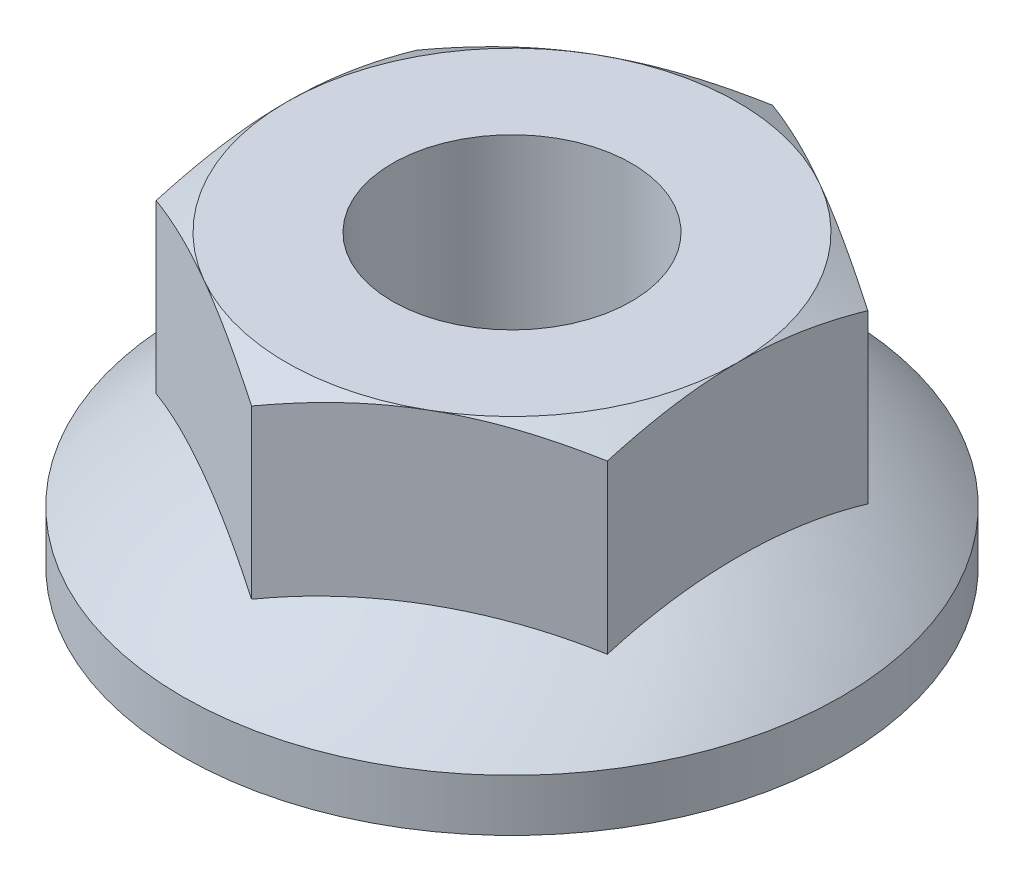
ISO-10303-21;
HEADER;
FILE_DESCRIPTION(('STEP AP214'),'2;1');
FILE_NAME('part.step','',(''),(''),'','','');
FILE_SCHEMA(('AUTOMOTIVE_DESIGN { 1 0 10303 214 1 1 1 1 }'));
ENDSEC;
DATA;
#1=APPLICATION_CONTEXT('core data for automotive mechanical design processes');
#2=APPLICATION_PROTOCOL_DEFINITION('international standard','automotive_design',2000,#1);
#3=PRODUCT_CONTEXT('',#1,'mechanical');
#4=PRODUCT('Part','Part','',(#3));
#5=PRODUCT_RELATED_PRODUCT_CATEGORY('part','',(#4));
#6=PRODUCT_DEFINITION_FORMATION('','',#4);
#7=PRODUCT_DEFINITION_CONTEXT('part definition',#1,'design');
#8=PRODUCT_DEFINITION('design','',#6,#7);
#9=PRODUCT_DEFINITION_SHAPE('','',#8);
#10=(LENGTH_UNIT() NAMED_UNIT(*) SI_UNIT(.MILLI.,.METRE.));
#11=(NAMED_UNIT(*) PLANE_ANGLE_UNIT() SI_UNIT($,.RADIAN.));
#12=(NAMED_UNIT(*) SI_UNIT($,.STERADIAN.) SOLID_ANGLE_UNIT());
#13=UNCERTAINTY_MEASURE_WITH_UNIT(LENGTH_MEASURE(1.E-05),#10,'distance_accuracy_value','');
#14=(GEOMETRIC_REPRESENTATION_CONTEXT(3) GLOBAL_UNCERTAINTY_ASSIGNED_CONTEXT((#13)) GLOBAL_UNIT_ASSIGNED_CONTEXT((#10,
#11,#12)) REPRESENTATION_CONTEXT('',''));
#15=CARTESIAN_POINT('',(0.,0.,0.));
#16=DIRECTION('',(0.,0.,1.));
#17=DIRECTION('',(1.,0.,0.));
#18=AXIS2_PLACEMENT_3D('',#15,#16,#17);
#19=CARTESIAN_POINT('',(0.,-5.78571428571428,0.));
#20=DIRECTION('',(0.,1.,0.));
#21=DIRECTION('',(1.,0.,0.));
#22=AXIS2_PLACEMENT_3D('',#19,#20,#21);
#23=SPHERICAL_SURFACE('',#22,8.78571428571428);
#24=CARTESIAN_POINT('',(1.95,-5.78571428571428,3.37749907475931));
#25=DIRECTION('',(0.5,0.,0.866025403784439));
#26=DIRECTION('',(0.866025403784439,0.,-0.5));
#27=AXIS2_PLACEMENT_3D('',#24,#25,#26);
#28=CIRCLE('',#27,7.87266000219774);
#29=CARTESIAN_POINT('',(0.,1.75807624095094,4.50333209967908));
#30=VERTEX_POINT('',#29);
#31=CARTESIAN_POINT('',(3.9,1.75807624095094,2.25166604983954));
#32=VERTEX_POINT('',#31);
#33=EDGE_CURVE('E231',#30,#32,#28,.F.);
#34=ORIENTED_EDGE('',*,*,#33,.F.);
#35=CARTESIAN_POINT('',(-1.95,-5.78571428571428,3.37749907475931));
#36=DIRECTION('',(-0.5,0.,0.866025403784439));
#37=DIRECTION('',(0.866025403784439,0.,0.5));
#38=AXIS2_PLACEMENT_3D('',#35,#36,#37);
#39=CIRCLE('',#38,7.87266000219774);
#40=CARTESIAN_POINT('',(-3.9,1.75807624095094,2.25166604983954));
#41=VERTEX_POINT('',#40);
#42=EDGE_CURVE('E254',#41,#30,#39,.F.);
#43=ORIENTED_EDGE('',*,*,#42,.F.);
#44=CARTESIAN_POINT('',(-3.9,-5.78571428571428,0.));
#45=DIRECTION('',(-1.,0.,0.));
#46=DIRECTION('',(0.,0.,1.));
#47=AXIS2_PLACEMENT_3D('',#44,#45,#46);
#48=CIRCLE('',#47,7.87266000219774);
#49=CARTESIAN_POINT('',(-3.9,1.75807624095094,-2.25166604983954));
#50=VERTEX_POINT('',#49);
#51=EDGE_CURVE('E251',#50,#41,#48,.F.);
#52=ORIENTED_EDGE('',*,*,#51,.F.);
#53=CARTESIAN_POINT('',(-1.95,-5.78571428571428,-3.37749907475931));
#54=DIRECTION('',(-0.5,0.,-0.866025403784438));
#55=DIRECTION('',(-0.866025403784438,0.,0.5));
#56=AXIS2_PLACEMENT_3D('',#53,#54,#55);
#57=CIRCLE('',#56,7.87266000219774);
#58=CARTESIAN_POINT('',(0.,1.75807624095094,-4.50333209967908));
#59=VERTEX_POINT('',#58);
#60=EDGE_CURVE('E248',#59,#50,#57,.F.);
#61=ORIENTED_EDGE('',*,*,#60,.F.);
#62=CARTESIAN_POINT('',(1.95,-5.78571428571428,-3.37749907475931));
#63=DIRECTION('',(0.5,0.,-0.866025403784439));
#64=DIRECTION('',(-0.866025403784439,0.,-0.5));
#65=AXIS2_PLACEMENT_3D('',#62,#63,#64);
#66=CIRCLE('',#65,7.87266000219774);
#67=CARTESIAN_POINT('',(3.9,1.75807624095094,-2.25166604983954));
#68=VERTEX_POINT('',#67);
#69=EDGE_CURVE('E245',#68,#59,#66,.F.);
#70=ORIENTED_EDGE('',*,*,#69,.F.);
#71=CARTESIAN_POINT('',(3.9,-5.78571428571428,0.));
#72=DIRECTION('',(1.,0.,0.));
#73=DIRECTION('',(0.,0.,-1.));
#74=AXIS2_PLACEMENT_3D('',#71,#72,#73);
#75=CIRCLE('',#74,7.87266000219774);
#76=EDGE_CURVE('E242',#32,#68,#75,.F.);
#77=ORIENTED_EDGE('',*,*,#76,.F.);
#78=EDGE_LOOP('',(#34,#43,#52,#61,#70,#77));
#79=FACE_BOUND('',#78,.T.);
#80=CARTESIAN_POINT('',(0.,0.899999999999998,0.));
#81=DIRECTION('',(0.,1.,0.));
#82=DIRECTION('',(0.,0.,1.));
#83=AXIS2_PLACEMENT_3D('',#80,#81,#82);
#84=CIRCLE('',#83,5.7);
#85=CARTESIAN_POINT('',(0.,0.899999999999998,5.7));
#86=VERTEX_POINT('',#85);
#87=EDGE_CURVE('E235',#86,#86,#84,.T.);
#88=ORIENTED_EDGE('',*,*,#87,.T.);
#89=EDGE_LOOP('',(#88));
#90=FACE_BOUND('',#89,.T.);
#91=ADVANCED_FACE('F36',(#79,#90),#23,.T.);
#92=CARTESIAN_POINT('',(0.,55.,0.));
#93=DIRECTION('',(0.,1.,0.));
#94=DIRECTION('',(0.,0.,1.));
#95=AXIS2_PLACEMENT_3D('',#92,#93,#94);
#96=CYLINDRICAL_SURFACE('',#95,5.7);
#97=CARTESIAN_POINT('',(0.,0.,0.));
#98=DIRECTION('',(0.,1.,0.));
#99=DIRECTION('',(0.,0.,1.));
#100=AXIS2_PLACEMENT_3D('',#97,#98,#99);
#101=CIRCLE('',#100,5.7);
#102=CARTESIAN_POINT('',(0.,0.,5.7));
#103=VERTEX_POINT('',#102);
#104=EDGE_CURVE('E237',#103,#103,#101,.T.);
#105=ORIENTED_EDGE('',*,*,#104,.T.);
#106=EDGE_LOOP('',(#105));
#107=FACE_BOUND('',#106,.T.);
#108=ORIENTED_EDGE('',*,*,#87,.F.);
#109=EDGE_LOOP('',(#108));
#110=FACE_BOUND('',#109,.T.);
#111=ADVANCED_FACE('F220',(#107,#110),#96,.T.);
#112=CARTESIAN_POINT('',(0.,0.,0.));
#113=DIRECTION('',(0.,-1.,0.));
#114=DIRECTION('',(0.,0.,-1.));
#115=AXIS2_PLACEMENT_3D('',#112,#113,#114);
#116=PLANE('',#115);
#117=CARTESIAN_POINT('',(0.,0.,0.));
#118=DIRECTION('',(0.,1.,0.));
#119=DIRECTION('',(0.,0.,1.));
#120=AXIS2_PLACEMENT_3D('',#117,#118,#119);
#121=CIRCLE('',#120,2.067);
#122=CARTESIAN_POINT('',(0.,0.,2.067));
#123=VERTEX_POINT('',#122);
#124=EDGE_CURVE('E126',#123,#123,#121,.T.);
#125=ORIENTED_EDGE('',*,*,#124,.T.);
#126=EDGE_LOOP('',(#125));
#127=FACE_BOUND('',#126,.T.);
#128=ORIENTED_EDGE('',*,*,#104,.F.);
#129=EDGE_LOOP('',(#128));
#130=FACE_BOUND('',#129,.T.);
#131=ADVANCED_FACE('F225',(#127,#130),#116,.T.);
#132=CARTESIAN_POINT('',(3.9,5.,2.25166604983954));
#133=DIRECTION('',(0.5,0.,0.866025403784439));
#134=DIRECTION('',(0.866025403784439,0.,-0.5));
#135=AXIS2_PLACEMENT_3D('',#132,#133,#134);
#136=PLANE('',#135);
#137=CARTESIAN_POINT('',(-0.000200000000000082,4.65159938060884,4.50344756973292));
#138=CARTESIAN_POINT('',(0.171184755948663,4.7087485432908,4.40449853475096));
#139=CARTESIAN_POINT('',(0.344048895227203,4.76072355207449,4.30469537740526));
#140=CARTESIAN_POINT('',(0.692770475854431,4.85144628830391,4.1033608789579));
#141=CARTESIAN_POINT('',(0.868634113331803,4.89016192166708,4.00182596051967));
#142=CARTESIAN_POINT('',(1.21818189703585,4.95042822234695,3.8000144535035));
#143=CARTESIAN_POINT('',(1.39181226217759,4.97237999753731,3.69976891544943));
#144=CARTESIAN_POINT('',(1.73988995117111,4.9985854749427,3.49880616801012));
#145=CARTESIAN_POINT('',(1.91433600991871,5.00286087795652,3.39808968903312));
#146=CARTESIAN_POINT('',(2.24029611773847,4.99396488127702,3.2098965330383));
#147=CARTESIAN_POINT('',(2.39185897047853,4.98297774999823,3.12239167920968));
#148=CARTESIAN_POINT('',(2.69399724856389,4.94815551398196,2.94795206302461));
#149=CARTESIAN_POINT('',(2.84457162893063,4.92430851477371,2.86101790398681));
#150=CARTESIAN_POINT('',(3.14733282069943,4.86469306648916,2.68621864841892));
#151=CARTESIAN_POINT('',(3.29948131430489,4.8286719181888,2.59837567467901));
#152=CARTESIAN_POINT('',(3.60150908691111,4.74691815520425,2.42399985886207));
#153=CARTESIAN_POINT('',(3.75139223511225,4.70120474892166,2.33746478290115));
#154=CARTESIAN_POINT('',(3.9002,4.65159938060884,2.2515505797857));
#155=B_SPLINE_CURVE_WITH_KNOTS('',3,(#137,#138,#139,#140,#141,#142,#143,#144,#145,#146,#147,
#148,#149,#150,#151,#152,#153,#154),.UNSPECIFIED.,.F.,.F.,(4,2,2,2,2,2,2,2,4),(0.,
0.618197035132391,1.23788000142301,1.8422261918665,2.44583022230471,2.97139286484403,
3.49744245160843,4.03516045034723,4.57182258173635),.UNSPECIFIED.);
#156=CARTESIAN_POINT('',(0.,4.65166604983954,4.50333209967908));
#157=VERTEX_POINT('',#156);
#158=CARTESIAN_POINT('',(1.95,5.,3.37749907475931));
#159=VERTEX_POINT('',#158);
#160=EDGE_CURVE('E104',#157,#159,#155,.T.);
#161=ORIENTED_EDGE('',*,*,#160,.F.);
#162=DIRECTION('',(0.,-1.,0.));
#163=VECTOR('',#162,1.);
#164=CARTESIAN_POINT('',(0.,5.,4.50333209967908));
#165=LINE('',#164,#163);
#166=EDGE_CURVE('E114',#157,#30,#165,.T.);
#167=ORIENTED_EDGE('',*,*,#166,.T.);
#168=ORIENTED_EDGE('',*,*,#33,.T.);
#169=DIRECTION('',(0.,-1.,0.));
#170=VECTOR('',#169,1.);
#171=CARTESIAN_POINT('',(3.9,5.,2.25166604983954));
#172=LINE('',#171,#170);
#173=CARTESIAN_POINT('',(3.9,4.65166604983954,2.25166604983954));
#174=VERTEX_POINT('',#173);
#175=EDGE_CURVE('E134',#174,#32,#172,.T.);
#176=ORIENTED_EDGE('',*,*,#175,.F.);
#177=EDGE_CURVE('E115',#159,#174,#155,.T.);
#178=ORIENTED_EDGE('',*,*,#177,.F.);
#179=EDGE_LOOP('',(#161,#167,#168,#176,#178));
#180=FACE_BOUND('',#179,.T.);
#181=ADVANCED_FACE('F132',(#180),#136,.T.);
#182=CARTESIAN_POINT('',(3.9,5.,-2.25166604983954));
#183=DIRECTION('',(1.,0.,0.));
#184=DIRECTION('',(0.,0.,-1.));
#185=AXIS2_PLACEMENT_3D('',#182,#183,#184);
#186=PLANE('',#185);
#187=CARTESIAN_POINT('',(3.9,3.07917792629661,-6.08432177184287));
#188=CARTESIAN_POINT('',(3.9,3.1620981895609,-5.91368140178134));
#189=CARTESIAN_POINT('',(3.9,3.24423377045389,-5.7426531777552));
#190=CARTESIAN_POINT('',(3.9,3.40649497934568,-5.39961491114535));
#191=CARTESIAN_POINT('',(3.9,3.48662029758723,-5.22760472220462));
#192=CARTESIAN_POINT('',(3.9,3.64481583556669,-4.8815273093431));
#193=CARTESIAN_POINT('',(3.9,3.72287280136912,-4.70745400621611));
#194=CARTESIAN_POINT('',(3.9,3.87584038658809,-4.35793550270963));
#195=CARTESIAN_POINT('',(3.9,3.950751152236,-4.18249036654178));
#196=CARTESIAN_POINT('',(3.9,4.09900019028108,-3.82414006320308));
#197=CARTESIAN_POINT('',(3.9,4.17220536925185,-3.64117953708319));
#198=CARTESIAN_POINT('',(3.9,4.31316212940151,-3.27313126153532));
#199=CARTESIAN_POINT('',(3.9,4.38091310354078,-3.08804327793909));
#200=CARTESIAN_POINT('',(3.9,4.50920922127308,-2.71578063532756));
#201=CARTESIAN_POINT('',(3.9,4.56976864749844,-2.52861094798131));
#202=CARTESIAN_POINT('',(3.9,4.68176218466094,-2.15158666244942));
#203=CARTESIAN_POINT('',(3.9,4.73319913202587,-1.96173291870356));
#204=CARTESIAN_POINT('',(3.9,4.82422595411218,-1.58029898099176));
#205=CARTESIAN_POINT('',(3.9,4.86388168140834,-1.38873479456714));
#206=CARTESIAN_POINT('',(3.9,4.92913241508771,-1.00318642113787));
#207=CARTESIAN_POINT('',(3.9,4.95472880998371,-0.809202475046858));
#208=CARTESIAN_POINT('',(3.9,4.98948534774504,-0.422331919835105));
#209=CARTESIAN_POINT('',(3.9,4.99885956393458,-0.229465029674007));
#210=CARTESIAN_POINT('',(3.9,5.00094273264838,0.156375622946879));
#211=CARTESIAN_POINT('',(3.9,4.99365146262056,0.349349386799463));
#212=CARTESIAN_POINT('',(3.9,4.96773130495737,0.675902537095185));
#213=CARTESIAN_POINT('',(3.9,4.95318922276409,0.809826843464921));
#214=CARTESIAN_POINT('',(3.9,4.91696428480891,1.0767127390436));
#215=CARTESIAN_POINT('',(3.9,4.89528048799788,1.20967419901933));
#216=CARTESIAN_POINT('',(3.9,4.82065430217073,1.60692794758031));
#217=CARTESIAN_POINT('',(3.9,4.75815013897267,1.86944499791454));
#218=CARTESIAN_POINT('',(3.9,4.64954364169666,2.26201758457893));
#219=CARTESIAN_POINT('',(3.9,4.61035647054217,2.39410235633202));
#220=CARTESIAN_POINT('',(3.9,4.52785595123815,2.65698935483899));
#221=CARTESIAN_POINT('',(3.9,4.48454257542994,2.78779157298919));
#222=CARTESIAN_POINT('',(3.9,4.39448935088307,3.04815370956295));
#223=CARTESIAN_POINT('',(3.9,4.34775059286303,3.17771400870979));
#224=CARTESIAN_POINT('',(3.9,4.25140203199345,3.4357575315207));
#225=CARTESIAN_POINT('',(3.9,4.20179226558378,3.56424076883152));
#226=CARTESIAN_POINT('',(3.9,4.07990434010133,3.8713248113076));
#227=CARTESIAN_POINT('',(3.9,4.0064789070627,4.04946944510241));
#228=CARTESIAN_POINT('',(3.9,3.85595449207032,4.40420470587554));
#229=CARTESIAN_POINT('',(3.9,3.77885526712492,4.58079522914429));
#230=CARTESIAN_POINT('',(3.9,3.62173416571981,4.93271412207387));
#231=CARTESIAN_POINT('',(3.9,3.5417116524511,5.10804220664676));
#232=CARTESIAN_POINT('',(3.9,3.37933503891529,5.45761707415352));
#233=CARTESIAN_POINT('',(3.9,3.29698088567242,5.63186383240939));
#234=CARTESIAN_POINT('',(3.9,3.04692511116692,6.15365090231731));
#235=CARTESIAN_POINT('',(3.9,2.87640966500424,6.4998417990242));
#236=CARTESIAN_POINT('',(3.9,2.53036940246811,7.18963705346156));
#237=CARTESIAN_POINT('',(3.9,2.35484523973633,7.53324174136513));
#238=CARTESIAN_POINT('',(3.9,2.01551141266023,8.18909122007097));
#239=CARTESIAN_POINT('',(3.9,1.8519949261735,8.50148798480561));
#240=CARTESIAN_POINT('',(3.9,1.52273598453401,9.12511955233899));
#241=CARTESIAN_POINT('',(3.9,1.35699344446375,9.43635431022844));
#242=CARTESIAN_POINT('',(3.9,1.02425312936935,10.0571028576461));
#243=CARTESIAN_POINT('',(3.9,0.857259774122418,10.3666190193858));
#244=CARTESIAN_POINT('',(3.9,0.521949337141364,10.9849104967807));
#245=CARTESIAN_POINT('',(3.9,0.353632333020366,11.2936858545082));
#246=CARTESIAN_POINT('',(3.9,0.184823057742641,11.602189863334));
#247=B_SPLINE_CURVE_WITH_KNOTS('',3,(#187,#188,#189,#190,#191,#192,#193,#194,#195,#196,#197,
#198,#199,#200,#201,#202,#203,#204,#205,#206,#207,#208,#209,#210,#211,#212,#213,#214,#215,#216,
#217,#218,#219,#220,#221,#222,#223,#224,#225,#226,#227,#228,#229,#230,#231,#232,#233,#234,#235,
#236,#237,#238,#239,#240,#241,#242,#243,#244,#245,#246),.UNSPECIFIED.,.F.,.F.,(4,2,2,2,2,2,2,2,
2,2,2,2,2,2,2,2,2,2,2,2,2,2,2,2,2,2,2,2,2,4),(0.,0.569168580260882,1.13842433050601,
1.71071890667252,2.28298685381383,2.87410654280125,3.46529193126533,4.05528284332578,
4.64508998825942,5.23153547093413,5.81792302528702,6.39651166541883,6.97510803210922,
7.37904725542088,7.78303972628634,8.5914582612306,9.00474817923754,9.4180408677964,
9.83120252173289,10.2443589328241,10.8223523046405,11.4003839592605,11.9785422920706,
12.5567137714204,13.7143613219592,14.8718584832686,15.9296577137364,16.987497411453,
18.0425688880894,19.0975789543823),.UNSPECIFIED.);
#248=CARTESIAN_POINT('',(3.9,5.,0.));
#249=VERTEX_POINT('',#248);
#250=EDGE_CURVE('E122',#174,#249,#247,.F.);
#251=ORIENTED_EDGE('',*,*,#250,.F.);
#252=ORIENTED_EDGE('',*,*,#175,.T.);
#253=ORIENTED_EDGE('',*,*,#76,.T.);
#254=DIRECTION('',(0.,-1.,0.));
#255=VECTOR('',#254,1.);
#256=CARTESIAN_POINT('',(3.9,5.,-2.25166604983954));
#257=LINE('',#256,#255);
#258=CARTESIAN_POINT('',(3.9,4.65166604983954,-2.25166604983954));
#259=VERTEX_POINT('',#258);
#260=EDGE_CURVE('E262',#259,#68,#257,.T.);
#261=ORIENTED_EDGE('',*,*,#260,.F.);
#262=EDGE_CURVE('E135',#249,#259,#247,.F.);
#263=ORIENTED_EDGE('',*,*,#262,.F.);
#264=EDGE_LOOP('',(#251,#252,#253,#261,#263));
#265=FACE_BOUND('',#264,.T.);
#266=ADVANCED_FACE('F198',(#265),#186,.T.);
#267=CARTESIAN_POINT('',(0.,5.,-4.50333209967908));
#268=DIRECTION('',(0.5,0.,-0.866025403784439));
#269=DIRECTION('',(-0.866025403784439,0.,-0.5));
#270=AXIS2_PLACEMENT_3D('',#267,#268,#269);
#271=PLANE('',#270);
#272=CARTESIAN_POINT('',(3.9002,4.65159938060884,-2.2515505797857));
#273=CARTESIAN_POINT('',(3.72881524405134,4.7087485432908,-2.35049961476766));
#274=CARTESIAN_POINT('',(3.5559511047728,4.76072355207449,-2.45030277211336));
#275=CARTESIAN_POINT('',(3.20722952414557,4.85144628830391,-2.65163727056072));
#276=CARTESIAN_POINT('',(3.03136588666819,4.89016192166708,-2.75317218899895));
#277=CARTESIAN_POINT('',(2.68181810296414,4.95042822234695,-2.95498369601512));
#278=CARTESIAN_POINT('',(2.50818773782241,4.97237999753731,-3.0552292340692));
#279=CARTESIAN_POINT('',(2.16011004882889,4.9985854749427,-3.25619198150851));
#280=CARTESIAN_POINT('',(1.98566399008129,5.00286087795652,-3.3569084604855));
#281=CARTESIAN_POINT('',(1.65970388226153,4.99396488127702,-3.54510161648032));
#282=CARTESIAN_POINT('',(1.50814102952147,4.98297774999823,-3.63260647030894));
#283=CARTESIAN_POINT('',(1.20600275143611,4.94815551398196,-3.80704608649401));
#284=CARTESIAN_POINT('',(1.05542837106937,4.92430851477371,-3.89398024553181));
#285=CARTESIAN_POINT('',(0.752667179300567,4.86469306648916,-4.0687795010997));
#286=CARTESIAN_POINT('',(0.600518685695105,4.8286719181888,-4.15662247483961));
#287=CARTESIAN_POINT('',(0.298490913088887,4.74691815520425,-4.33099829065655));
#288=CARTESIAN_POINT('',(0.14860776488775,4.70120474892166,-4.41753336661747));
#289=CARTESIAN_POINT('',(-0.000200000000000154,4.65159938060884,-4.50344756973292));
#290=B_SPLINE_CURVE_WITH_KNOTS('',3,(#272,#273,#274,#275,#276,#277,#278,#279,#280,#281,#282,
#283,#284,#285,#286,#287,#288,#289),.UNSPECIFIED.,.F.,.F.,(4,2,2,2,2,2,2,2,4),(0.,
0.618197035132391,1.237880001423,1.8422261918665,2.44583022230471,2.97139286484403,
3.49744245160843,4.03516045034723,4.57182258173635),.UNSPECIFIED.);
#291=CARTESIAN_POINT('',(1.95,5.,-3.37749907475931));
#292=VERTEX_POINT('',#291);
#293=EDGE_CURVE('E192',#259,#292,#290,.T.);
#294=ORIENTED_EDGE('',*,*,#293,.F.);
#295=ORIENTED_EDGE('',*,*,#260,.T.);
#296=ORIENTED_EDGE('',*,*,#69,.T.);
#297=DIRECTION('',(0.,-1.,0.));
#298=VECTOR('',#297,1.);
#299=CARTESIAN_POINT('',(0.,5.,-4.50333209967908));
#300=LINE('',#299,#298);
#301=CARTESIAN_POINT('',(0.,4.65166604983954,-4.50333209967908));
#302=VERTEX_POINT('',#301);
#303=EDGE_CURVE('E261',#302,#59,#300,.T.);
#304=ORIENTED_EDGE('',*,*,#303,.F.);
#305=EDGE_CURVE('E186',#292,#302,#290,.T.);
#306=ORIENTED_EDGE('',*,*,#305,.F.);
#307=EDGE_LOOP('',(#294,#295,#296,#304,#306));
#308=FACE_BOUND('',#307,.T.);
#309=ADVANCED_FACE('F194',(#308),#271,.T.);
#310=CARTESIAN_POINT('',(-3.9,5.,-2.25166604983954));
#311=DIRECTION('',(-0.5,0.,-0.866025403784438));
#312=DIRECTION('',(-0.866025403784438,0.,0.5));
#313=AXIS2_PLACEMENT_3D('',#310,#311,#312);
#314=PLANE('',#313);
#315=CARTESIAN_POINT('',(0.000199999999999611,4.65159938060884,-4.50344756973292));
#316=CARTESIAN_POINT('',(-0.171184755948662,4.7087485432908,-4.40449853475096));
#317=CARTESIAN_POINT('',(-0.344048895227202,4.76072355207449,-4.30469537740526));
#318=CARTESIAN_POINT('',(-0.692770475854432,4.85144628830391,-4.1033608789579));
#319=CARTESIAN_POINT('',(-0.868634113331803,4.89016192166708,-4.00182596051967));
#320=CARTESIAN_POINT('',(-1.21818189703585,4.95042822234695,-3.8000144535035));
#321=CARTESIAN_POINT('',(-1.39181226217759,4.97237999753731,-3.69976891544943));
#322=CARTESIAN_POINT('',(-1.73988995117111,4.9985854749427,-3.49880616801011));
#323=CARTESIAN_POINT('',(-1.91433600991871,5.00286087795652,-3.39808968903312));
#324=CARTESIAN_POINT('',(-2.24029611773847,4.99396488127702,-3.2098965330383));
#325=CARTESIAN_POINT('',(-2.39185897047853,4.98297774999823,-3.12239167920968));
#326=CARTESIAN_POINT('',(-2.69399724856389,4.94815551398196,-2.94795206302461));
#327=CARTESIAN_POINT('',(-2.84457162893063,4.92430851477371,-2.86101790398681));
#328=CARTESIAN_POINT('',(-3.14733282069943,4.86469306648916,-2.68621864841892));
#329=CARTESIAN_POINT('',(-3.29948131430489,4.8286719181888,-2.59837567467901));
#330=CARTESIAN_POINT('',(-3.60150908691111,4.74691815520425,-2.42399985886207));
#331=CARTESIAN_POINT('',(-3.75139223511225,4.70120474892166,-2.33746478290115));
#332=CARTESIAN_POINT('',(-3.9002,4.65159938060884,-2.2515505797857));
#333=B_SPLINE_CURVE_WITH_KNOTS('',3,(#315,#316,#317,#318,#319,#320,#321,#322,#323,#324,#325,
#326,#327,#328,#329,#330,#331,#332),.UNSPECIFIED.,.F.,.F.,(4,2,2,2,2,2,2,2,4),(0.,
0.618197035132391,1.23788000142301,1.8422261918665,2.44583022230471,2.97139286484403,
3.49744245160843,4.03516045034724,4.57182258173636),.UNSPECIFIED.);
#334=CARTESIAN_POINT('',(-1.95,5.,-3.37749907475931));
#335=VERTEX_POINT('',#334);
#336=EDGE_CURVE('E193',#302,#335,#333,.T.);
#337=ORIENTED_EDGE('',*,*,#336,.F.);
#338=ORIENTED_EDGE('',*,*,#303,.T.);
#339=ORIENTED_EDGE('',*,*,#60,.T.);
#340=DIRECTION('',(0.,-1.,0.));
#341=VECTOR('',#340,1.);
#342=CARTESIAN_POINT('',(-3.9,5.,-2.25166604983954));
#343=LINE('',#342,#341);
#344=CARTESIAN_POINT('',(-3.9,4.6516660498398,-2.25166604983993));
#345=VERTEX_POINT('',#344);
#346=EDGE_CURVE('E259',#345,#50,#343,.T.);
#347=ORIENTED_EDGE('',*,*,#346,.F.);
#348=EDGE_CURVE('E180',#335,#345,#333,.T.);
#349=ORIENTED_EDGE('',*,*,#348,.F.);
#350=EDGE_LOOP('',(#337,#338,#339,#347,#349));
#351=FACE_BOUND('',#350,.T.);
#352=ADVANCED_FACE('F197',(#351),#314,.T.);
#353=CARTESIAN_POINT('',(-3.9,5.,2.25166604983954));
#354=DIRECTION('',(-1.,0.,0.));
#355=DIRECTION('',(0.,0.,1.));
#356=AXIS2_PLACEMENT_3D('',#353,#354,#355);
#357=PLANE('',#356);
#358=CARTESIAN_POINT('',(-3.9,3.07917792629661,-6.08432177184287));
#359=CARTESIAN_POINT('',(-3.9,3.1620981895609,-5.91368140178134));
#360=CARTESIAN_POINT('',(-3.9,3.24423377045389,-5.7426531777552));
#361=CARTESIAN_POINT('',(-3.9,3.40649497934568,-5.39961491114535));
#362=CARTESIAN_POINT('',(-3.9,3.48662029758723,-5.22760472220462));
#363=CARTESIAN_POINT('',(-3.9,3.64481583556669,-4.8815273093431));
#364=CARTESIAN_POINT('',(-3.9,3.72287280136912,-4.70745400621611));
#365=CARTESIAN_POINT('',(-3.9,3.87584038658809,-4.35793550270963));
#366=CARTESIAN_POINT('',(-3.9,3.950751152236,-4.18249036654178));
#367=CARTESIAN_POINT('',(-3.9,4.09900019028108,-3.82414006320308));
#368=CARTESIAN_POINT('',(-3.9,4.17220536925185,-3.64117953708319));
#369=CARTESIAN_POINT('',(-3.9,4.31316212940151,-3.27313126153532));
#370=CARTESIAN_POINT('',(-3.9,4.38091310354078,-3.08804327793909));
#371=CARTESIAN_POINT('',(-3.9,4.50920922127308,-2.71578063532756));
#372=CARTESIAN_POINT('',(-3.9,4.56976864749844,-2.52861094798131));
#373=CARTESIAN_POINT('',(-3.9,4.68176218466094,-2.15158666244941));
#374=CARTESIAN_POINT('',(-3.9,4.73319913202587,-1.96173291870356));
#375=CARTESIAN_POINT('',(-3.9,4.82422595411218,-1.58029898099176));
#376=CARTESIAN_POINT('',(-3.9,4.86388168140834,-1.38873479456714));
#377=CARTESIAN_POINT('',(-3.9,4.92913241508771,-1.00318642113787));
#378=CARTESIAN_POINT('',(-3.9,4.95472880998371,-0.809202475046855));
#379=CARTESIAN_POINT('',(-3.9,4.98948534774504,-0.422331919835101));
#380=CARTESIAN_POINT('',(-3.9,4.99885956393457,-0.229465029674004));
#381=CARTESIAN_POINT('',(-3.9,5.00094273264838,0.156375622946883));
#382=CARTESIAN_POINT('',(-3.9,4.99365146262056,0.349349386799466));
#383=CARTESIAN_POINT('',(-3.9,4.96773130495737,0.675902537095188));
#384=CARTESIAN_POINT('',(-3.9,4.95318922276409,0.809826843464924));
#385=CARTESIAN_POINT('',(-3.9,4.91696428480891,1.07671273904361));
#386=CARTESIAN_POINT('',(-3.9,4.89528048799788,1.20967419901934));
#387=CARTESIAN_POINT('',(-3.9,4.82065430217072,1.60692794758032));
#388=CARTESIAN_POINT('',(-3.9,4.75815013897267,1.86944499791455));
#389=CARTESIAN_POINT('',(-3.9,4.64954364169665,2.26201758457893));
#390=CARTESIAN_POINT('',(-3.9,4.61035647054216,2.39410235633203));
#391=CARTESIAN_POINT('',(-3.9,4.52785595123815,2.656989354839));
#392=CARTESIAN_POINT('',(-3.9,4.48454257542993,2.7877915729892));
#393=CARTESIAN_POINT('',(-3.9,4.39448935088307,3.04815370956295));
#394=CARTESIAN_POINT('',(-3.9,4.34775059286302,3.1777140087098));
#395=CARTESIAN_POINT('',(-3.9,4.25140203199344,3.4357575315207));
#396=CARTESIAN_POINT('',(-3.9,4.20179226558377,3.56424076883153));
#397=CARTESIAN_POINT('',(-3.9,4.07990434010133,3.8713248113076));
#398=CARTESIAN_POINT('',(-3.9,4.00647890706269,4.04946944510242));
#399=CARTESIAN_POINT('',(-3.9,3.85595449207032,4.40420470587555));
#400=CARTESIAN_POINT('',(-3.9,3.77885526712491,4.5807952291443));
#401=CARTESIAN_POINT('',(-3.9,3.62173416571981,4.93271412207387));
#402=CARTESIAN_POINT('',(-3.9,3.5417116524511,5.10804220664676));
#403=CARTESIAN_POINT('',(-3.9,3.37933503891529,5.45761707415352));
#404=CARTESIAN_POINT('',(-3.9,3.29698088567242,5.6318638324094));
#405=CARTESIAN_POINT('',(-3.9,3.04692511116691,6.15365090231732));
#406=CARTESIAN_POINT('',(-3.9,2.87640966500423,6.49984179902421));
#407=CARTESIAN_POINT('',(-3.9,2.5303694024681,7.18963705346156));
#408=CARTESIAN_POINT('',(-3.9,2.35484523973633,7.53324174136513));
#409=CARTESIAN_POINT('',(-3.9,2.01551141266023,8.18909122007097));
#410=CARTESIAN_POINT('',(-3.9,1.8519949261735,8.50148798480561));
#411=CARTESIAN_POINT('',(-3.9,1.52273598453401,9.12511955233899));
#412=CARTESIAN_POINT('',(-3.9,1.35699344446375,9.43635431022844));
#413=CARTESIAN_POINT('',(-3.9,1.02425312936935,10.0571028576461));
#414=CARTESIAN_POINT('',(-3.9,0.857259774122417,10.3666190193858));
#415=CARTESIAN_POINT('',(-3.9,0.521949337141363,10.9849104967807));
#416=CARTESIAN_POINT('',(-3.9,0.353632333020364,11.2936858545082));
#417=CARTESIAN_POINT('',(-3.9,0.18482305774264,11.602189863334));
#418=B_SPLINE_CURVE_WITH_KNOTS('',3,(#358,#359,#360,#361,#362,#363,#364,#365,#366,#367,#368,
#369,#370,#371,#372,#373,#374,#375,#376,#377,#378,#379,#380,#381,#382,#383,#384,#385,#386,#387,
#388,#389,#390,#391,#392,#393,#394,#395,#396,#397,#398,#399,#400,#401,#402,#403,#404,#405,#406,
#407,#408,#409,#410,#411,#412,#413,#414,#415,#416,#417),.UNSPECIFIED.,.F.,.F.,(4,2,2,2,2,2,2,2,
2,2,2,2,2,2,2,2,2,2,2,2,2,2,2,2,2,2,2,2,2,4),(0.,0.569168580260881,1.13842433050601,
1.71071890667252,2.28298685381383,2.87410654280125,3.46529193126533,4.05528284332578,
4.64508998825942,5.23153547093413,5.81792302528702,6.39651166541884,6.97510803210923,
7.37904725542089,7.78303972628634,8.5914582612306,9.00474817923754,9.41804086779641,
9.83120252173289,10.2443589328241,10.8223523046405,11.4003839592605,11.9785422920706,
12.5567137714204,13.7143613219592,14.8718584832686,15.9296577137364,16.987497411453,
18.0425688880894,19.0975789543823),.UNSPECIFIED.);
#419=CARTESIAN_POINT('',(-3.9,5.,0.));
#420=VERTEX_POINT('',#419);
#421=EDGE_CURVE('E273',#345,#420,#418,.T.);
#422=ORIENTED_EDGE('',*,*,#421,.F.);
#423=ORIENTED_EDGE('',*,*,#346,.T.);
#424=ORIENTED_EDGE('',*,*,#51,.T.);
#425=DIRECTION('',(0.,-1.,0.));
#426=VECTOR('',#425,1.);
#427=CARTESIAN_POINT('',(-3.9,5.,2.25166604983954));
#428=LINE('',#427,#426);
#429=CARTESIAN_POINT('',(-3.9,4.65166604983954,2.25166604983954));
#430=VERTEX_POINT('',#429);
#431=EDGE_CURVE('E257',#430,#41,#428,.T.);
#432=ORIENTED_EDGE('',*,*,#431,.F.);
#433=EDGE_CURVE('E172',#420,#430,#418,.T.);
#434=ORIENTED_EDGE('',*,*,#433,.F.);
#435=EDGE_LOOP('',(#422,#423,#424,#432,#434));
#436=FACE_BOUND('',#435,.T.);
#437=ADVANCED_FACE('F203',(#436),#357,.T.);
#438=CARTESIAN_POINT('',(0.,5.,4.50333209967908));
#439=DIRECTION('',(-0.5,0.,0.866025403784439));
#440=DIRECTION('',(0.866025403784439,0.,0.5));
#441=AXIS2_PLACEMENT_3D('',#438,#439,#440);
#442=PLANE('',#441);
#443=CARTESIAN_POINT('',(-3.9002,4.65159938060884,2.2515505797857));
#444=CARTESIAN_POINT('',(-3.72881524405134,4.7087485432908,2.35049961476766));
#445=CARTESIAN_POINT('',(-3.5559511047728,4.76072355207449,2.45030277211336));
#446=CARTESIAN_POINT('',(-3.20722952414557,4.85144628830391,2.65163727056072));
#447=CARTESIAN_POINT('',(-3.0313658866682,4.89016192166707,2.75317218899895));
#448=CARTESIAN_POINT('',(-2.68181810296415,4.95042822234695,2.95498369601512));
#449=CARTESIAN_POINT('',(-2.50818773782241,4.97237999753731,3.0552292340692));
#450=CARTESIAN_POINT('',(-2.16011004882889,4.9985854749427,3.25619198150851));
#451=CARTESIAN_POINT('',(-1.98566399008129,5.00286087795652,3.3569084604855));
#452=CARTESIAN_POINT('',(-1.65970388226153,4.99396488127702,3.54510161648032));
#453=CARTESIAN_POINT('',(-1.50814102952147,4.98297774999823,3.63260647030894));
#454=CARTESIAN_POINT('',(-1.20600275143611,4.94815551398196,3.80704608649401));
#455=CARTESIAN_POINT('',(-1.05542837106937,4.92430851477371,3.89398024553181));
#456=CARTESIAN_POINT('',(-0.752667179300568,4.86469306648916,4.0687795010997));
#457=CARTESIAN_POINT('',(-0.600518685695106,4.8286719181888,4.15662247483961));
#458=CARTESIAN_POINT('',(-0.298490913088888,4.74691815520425,4.33099829065656));
#459=CARTESIAN_POINT('',(-0.148607764887751,4.70120474892165,4.41753336661747));
#460=CARTESIAN_POINT('',(0.000200000000000112,4.65159938060884,4.50344756973292));
#461=B_SPLINE_CURVE_WITH_KNOTS('',3,(#443,#444,#445,#446,#447,#448,#449,#450,#451,#452,#453,
#454,#455,#456,#457,#458,#459,#460),.UNSPECIFIED.,.F.,.F.,(4,2,2,2,2,2,2,2,4),(0.,
0.618197035132391,1.23788000142301,1.8422261918665,2.44583022230471,2.97139286484403,
3.49744245160843,4.03516045034724,4.57182258173636),.UNSPECIFIED.);
#462=CARTESIAN_POINT('',(-1.95,5.,3.37749907475931));
#463=VERTEX_POINT('',#462);
#464=EDGE_CURVE('E279',#430,#463,#461,.T.);
#465=ORIENTED_EDGE('',*,*,#464,.F.);
#466=ORIENTED_EDGE('',*,*,#431,.T.);
#467=ORIENTED_EDGE('',*,*,#42,.T.);
#468=ORIENTED_EDGE('',*,*,#166,.F.);
#469=EDGE_CURVE('E110',#463,#157,#461,.T.);
#470=ORIENTED_EDGE('',*,*,#469,.F.);
#471=EDGE_LOOP('',(#465,#466,#467,#468,#470));
#472=FACE_BOUND('',#471,.T.);
#473=ADVANCED_FACE('F207',(#472),#442,.T.);
#474=CARTESIAN_POINT('',(0.,3.84529946162077,0.));
#475=DIRECTION('',(0.,-1.,0.));
#476=DIRECTION('',(0.,0.,-1.));
#477=AXIS2_PLACEMENT_3D('',#474,#475,#476);
#478=CONICAL_SURFACE('',#477,5.9,1.04719755119661);
#479=ORIENTED_EDGE('',*,*,#305,.T.);
#480=ORIENTED_EDGE('',*,*,#336,.T.);
#481=CARTESIAN_POINT('',(0.,5.,0.));
#482=DIRECTION('',(0.,-1.,0.));
#483=DIRECTION('',(0.,0.,-1.));
#484=AXIS2_PLACEMENT_3D('',#481,#482,#483);
#485=CIRCLE('',#484,3.9);
#486=EDGE_CURVE('E39',#292,#335,#485,.F.);
#487=ORIENTED_EDGE('',*,*,#486,.F.);
#488=EDGE_LOOP('',(#479,#480,#487));
#489=FACE_BOUND('',#488,.T.);
#490=ADVANCED_FACE('F211',(#489),#478,.T.);
#491=ORIENTED_EDGE('',*,*,#262,.T.);
#492=ORIENTED_EDGE('',*,*,#293,.T.);
#493=EDGE_CURVE('E130',#249,#292,#485,.F.);
#494=ORIENTED_EDGE('',*,*,#493,.F.);
#495=EDGE_LOOP('',(#491,#492,#494));
#496=FACE_BOUND('',#495,.T.);
#497=ADVANCED_FACE('F216',(#496),#478,.T.);
#498=ORIENTED_EDGE('',*,*,#177,.T.);
#499=ORIENTED_EDGE('',*,*,#250,.T.);
#500=CARTESIAN_POINT('',(0.,5.,0.));
#501=DIRECTION('',(0.,1.,0.));
#502=DIRECTION('',(0.,0.,1.));
#503=AXIS2_PLACEMENT_3D('',#500,#501,#502);
#504=CIRCLE('',#503,3.9);
#505=EDGE_CURVE('E119',#159,#249,#504,.T.);
#506=ORIENTED_EDGE('',*,*,#505,.F.);
#507=EDGE_LOOP('',(#498,#499,#506));
#508=FACE_BOUND('',#507,.T.);
#509=ADVANCED_FACE('F120',(#508),#478,.T.);
#510=ORIENTED_EDGE('',*,*,#160,.T.);
#511=EDGE_CURVE('E107',#463,#159,#485,.F.);
#512=ORIENTED_EDGE('',*,*,#511,.F.);
#513=ORIENTED_EDGE('',*,*,#469,.T.);
#514=EDGE_LOOP('',(#510,#512,#513));
#515=FACE_BOUND('',#514,.T.);
#516=ADVANCED_FACE('F106',(#515),#478,.T.);
#517=ORIENTED_EDGE('',*,*,#433,.T.);
#518=ORIENTED_EDGE('',*,*,#464,.T.);
#519=EDGE_CURVE('E44',#420,#463,#485,.F.);
#520=ORIENTED_EDGE('',*,*,#519,.F.);
#521=EDGE_LOOP('',(#517,#518,#520));
#522=FACE_BOUND('',#521,.T.);
#523=ADVANCED_FACE('F154',(#522),#478,.T.);
#524=ORIENTED_EDGE('',*,*,#348,.T.);
#525=ORIENTED_EDGE('',*,*,#421,.T.);
#526=EDGE_CURVE('E11',#335,#420,#485,.F.);
#527=ORIENTED_EDGE('',*,*,#526,.F.);
#528=EDGE_LOOP('',(#524,#525,#527));
#529=FACE_BOUND('',#528,.T.);
#530=ADVANCED_FACE('F159',(#529),#478,.T.);
#531=CARTESIAN_POINT('',(0.,5.,0.));
#532=DIRECTION('',(0.,-1.,0.));
#533=DIRECTION('',(0.,0.,-1.));
#534=AXIS2_PLACEMENT_3D('',#531,#532,#533);
#535=PLANE('',#534);
#536=CARTESIAN_POINT('',(0.,5.,0.));
#537=DIRECTION('',(0.,1.,0.));
#538=DIRECTION('',(0.,0.,1.));
#539=AXIS2_PLACEMENT_3D('',#536,#537,#538);
#540=CIRCLE('',#539,2.067);
#541=CARTESIAN_POINT('',(0.,5.,2.067));
#542=VERTEX_POINT('',#541);
#543=EDGE_CURVE('E396',#542,#542,#540,.T.);
#544=ORIENTED_EDGE('',*,*,#543,.F.);
#545=EDGE_LOOP('',(#544));
#546=FACE_BOUND('',#545,.T.);
#547=ORIENTED_EDGE('',*,*,#486,.T.);
#548=ORIENTED_EDGE('',*,*,#526,.T.);
#549=ORIENTED_EDGE('',*,*,#519,.T.);
#550=ORIENTED_EDGE('',*,*,#511,.T.);
#551=ORIENTED_EDGE('',*,*,#505,.T.);
#552=ORIENTED_EDGE('',*,*,#493,.T.);
#553=EDGE_LOOP('',(#547,#548,#549,#550,#551,#552));
#554=FACE_BOUND('',#553,.T.);
#555=ADVANCED_FACE('F129',(#546,#554),#535,.F.);
#556=CARTESIAN_POINT('',(0.,5.,0.));
#557=DIRECTION('',(0.,1.,0.));
#558=DIRECTION('',(0.,0.,1.));
#559=AXIS2_PLACEMENT_3D('',#556,#557,#558);
#560=CYLINDRICAL_SURFACE('',#559,2.067);
#561=ORIENTED_EDGE('',*,*,#124,.F.);
#562=EDGE_LOOP('',(#561));
#563=FACE_BOUND('',#562,.T.);
#564=ORIENTED_EDGE('',*,*,#543,.T.);
#565=EDGE_LOOP('',(#564));
#566=FACE_BOUND('',#565,.T.);
#567=ADVANCED_FACE('F161',(#563,#566),#560,.F.);
#568=CLOSED_SHELL('',(#91,#111,#131,#181,#266,#309,#352,#437,#473,#490,#497,#509,#516,#523,#530,
#555,#567));
#569=MANIFOLD_SOLID_BREP('B2',#568);
#570=ADVANCED_BREP_SHAPE_REPRESENTATION('',(#18,#569),#14);
#571=SHAPE_DEFINITION_REPRESENTATION(#9,#570);
ENDSEC;
END-ISO-10303-21;
